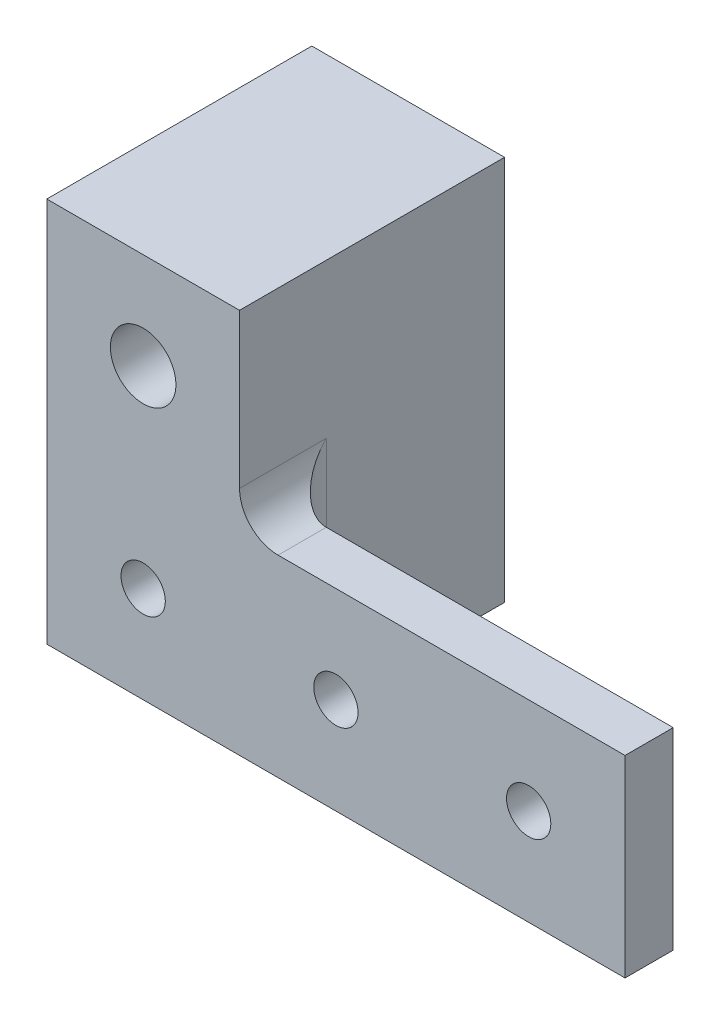
ISO-10303-21;
HEADER;
FILE_DESCRIPTION(('STEP AP214'),'2;1');
FILE_NAME('part.step','',(''),(''),'','','');
FILE_SCHEMA(('AUTOMOTIVE_DESIGN { 1 0 10303 214 1 1 1 1 }'));
ENDSEC;
DATA;
#1=APPLICATION_CONTEXT('core data for automotive mechanical design processes');
#2=APPLICATION_PROTOCOL_DEFINITION('international standard','automotive_design',2000,#1);
#3=PRODUCT_CONTEXT('',#1,'mechanical');
#4=PRODUCT('Part','Part','',(#3));
#5=PRODUCT_RELATED_PRODUCT_CATEGORY('part','',(#4));
#6=PRODUCT_DEFINITION_FORMATION('','',#4);
#7=PRODUCT_DEFINITION_CONTEXT('part definition',#1,'design');
#8=PRODUCT_DEFINITION('design','',#6,#7);
#9=PRODUCT_DEFINITION_SHAPE('','',#8);
#10=(LENGTH_UNIT() NAMED_UNIT(*) SI_UNIT(.MILLI.,.METRE.));
#11=(NAMED_UNIT(*) PLANE_ANGLE_UNIT() SI_UNIT($,.RADIAN.));
#12=(NAMED_UNIT(*) SI_UNIT($,.STERADIAN.) SOLID_ANGLE_UNIT());
#13=UNCERTAINTY_MEASURE_WITH_UNIT(LENGTH_MEASURE(1.E-05),#10,'distance_accuracy_value','');
#14=(GEOMETRIC_REPRESENTATION_CONTEXT(3) GLOBAL_UNCERTAINTY_ASSIGNED_CONTEXT((#13)) GLOBAL_UNIT_ASSIGNED_CONTEXT((#10,
#11,#12)) REPRESENTATION_CONTEXT('',''));
#15=CARTESIAN_POINT('',(0.,0.,0.));
#16=DIRECTION('',(0.,0.,1.));
#17=DIRECTION('',(1.,0.,0.));
#18=AXIS2_PLACEMENT_3D('',#15,#16,#17);
#19=CARTESIAN_POINT('',(12.7,38.1,0.));
#20=DIRECTION('',(0.,0.,1.));
#21=DIRECTION('',(1.,0.,0.));
#22=AXIS2_PLACEMENT_3D('',#19,#20,#21);
#23=CYLINDRICAL_SURFACE('',#22,2.921);
#24=CARTESIAN_POINT('',(12.7,38.1,0.));
#25=DIRECTION('',(0.,0.,1.));
#26=DIRECTION('',(1.,0.,0.));
#27=AXIS2_PLACEMENT_3D('',#24,#25,#26);
#28=CIRCLE('',#27,2.921);
#29=CARTESIAN_POINT('',(15.621,38.1,0.));
#30=VERTEX_POINT('',#29);
#31=EDGE_CURVE('E168',#30,#30,#28,.T.);
#32=ORIENTED_EDGE('',*,*,#31,.F.);
#33=EDGE_LOOP('',(#32));
#34=FACE_BOUND('',#33,.T.);
#35=CARTESIAN_POINT('',(12.7,38.1,22.225));
#36=DIRECTION('',(0.,0.,1.));
#37=DIRECTION('',(1.,0.,0.));
#38=AXIS2_PLACEMENT_3D('',#35,#36,#37);
#39=CIRCLE('',#38,2.921);
#40=CARTESIAN_POINT('',(15.621,38.1,22.225));
#41=VERTEX_POINT('',#40);
#42=EDGE_CURVE('E41',#41,#41,#39,.F.);
#43=ORIENTED_EDGE('',*,*,#42,.F.);
#44=EDGE_LOOP('',(#43));
#45=FACE_BOUND('',#44,.T.);
#46=ADVANCED_FACE('F37',(#34,#45),#23,.F.);
#47=CARTESIAN_POINT('',(76.2,0.,34.925));
#48=DIRECTION('',(0.,1.,0.));
#49=DIRECTION('',(-1.,0.,0.));
#50=AXIS2_PLACEMENT_3D('',#47,#48,#49);
#51=PLANE('',#50);
#52=DIRECTION('',(1.,0.,0.));
#53=VECTOR('',#52,1.);
#54=CARTESIAN_POINT('',(76.2,0.,0.));
#55=LINE('',#54,#53);
#56=CARTESIAN_POINT('',(0.,0.,0.));
#57=VERTEX_POINT('',#56);
#58=CARTESIAN_POINT('',(25.4,0.,0.));
#59=VERTEX_POINT('',#58);
#60=EDGE_CURVE('E171',#57,#59,#55,.T.);
#61=ORIENTED_EDGE('',*,*,#60,.T.);
#62=DIRECTION('',(0.,0.,-1.));
#63=VECTOR('',#62,1.);
#64=CARTESIAN_POINT('',(25.4,0.,0.));
#65=LINE('',#64,#63);
#66=CARTESIAN_POINT('',(25.4,0.,23.495));
#67=VERTEX_POINT('',#66);
#68=EDGE_CURVE('E118',#67,#59,#65,.T.);
#69=ORIENTED_EDGE('',*,*,#68,.F.);
#70=CARTESIAN_POINT('',(30.48,0.,23.495));
#71=DIRECTION('',(0.,1.,0.));
#72=DIRECTION('',(-1.,0.,0.));
#73=AXIS2_PLACEMENT_3D('',#70,#71,#72);
#74=CIRCLE('',#73,5.08);
#75=CARTESIAN_POINT('',(30.48,0.,28.575));
#76=VERTEX_POINT('',#75);
#77=EDGE_CURVE('E11',#67,#76,#74,.T.);
#78=ORIENTED_EDGE('',*,*,#77,.T.);
#79=DIRECTION('',(-1.,0.,0.));
#80=VECTOR('',#79,1.);
#81=CARTESIAN_POINT('',(76.2,0.,28.575));
#82=LINE('',#81,#80);
#83=CARTESIAN_POINT('',(76.2,0.,28.575));
#84=VERTEX_POINT('',#83);
#85=EDGE_CURVE('E110',#84,#76,#82,.T.);
#86=ORIENTED_EDGE('',*,*,#85,.F.);
#87=DIRECTION('',(0.,0.,-1.));
#88=VECTOR('',#87,1.);
#89=CARTESIAN_POINT('',(76.2,0.,34.925));
#90=LINE('',#89,#88);
#91=CARTESIAN_POINT('',(76.2,0.,34.925));
#92=VERTEX_POINT('',#91);
#93=EDGE_CURVE('E124',#92,#84,#90,.T.);
#94=ORIENTED_EDGE('',*,*,#93,.F.);
#95=DIRECTION('',(1.,0.,0.));
#96=VECTOR('',#95,1.);
#97=CARTESIAN_POINT('',(76.2,0.,34.925));
#98=LINE('',#97,#96);
#99=CARTESIAN_POINT('',(0.,0.,34.925));
#100=VERTEX_POINT('',#99);
#101=EDGE_CURVE('E183',#100,#92,#98,.T.);
#102=ORIENTED_EDGE('',*,*,#101,.F.);
#103=DIRECTION('',(0.,0.,-1.));
#104=VECTOR('',#103,1.);
#105=CARTESIAN_POINT('',(0.,0.,34.925));
#106=LINE('',#105,#104);
#107=EDGE_CURVE('E195',#100,#57,#106,.T.);
#108=ORIENTED_EDGE('',*,*,#107,.T.);
#109=EDGE_LOOP('',(#61,#69,#78,#86,#94,#102,#108));
#110=FACE_BOUND('',#109,.T.);
#111=ADVANCED_FACE('F122',(#110),#51,.F.);
#112=CARTESIAN_POINT('',(76.2,25.4,34.925));
#113=DIRECTION('',(-1.,0.,0.));
#114=DIRECTION('',(0.,0.,1.));
#115=AXIS2_PLACEMENT_3D('',#112,#113,#114);
#116=PLANE('',#115);
#117=ORIENTED_EDGE('',*,*,#93,.T.);
#118=DIRECTION('',(0.,-1.,0.));
#119=VECTOR('',#118,1.);
#120=CARTESIAN_POINT('',(76.2,50.8,28.575));
#121=LINE('',#120,#119);
#122=CARTESIAN_POINT('',(76.2,25.4,28.575));
#123=VERTEX_POINT('',#122);
#124=EDGE_CURVE('E108',#123,#84,#121,.T.);
#125=ORIENTED_EDGE('',*,*,#124,.F.);
#126=DIRECTION('',(0.,0.,-1.));
#127=VECTOR('',#126,1.);
#128=CARTESIAN_POINT('',(76.2,25.4,34.925));
#129=LINE('',#128,#127);
#130=CARTESIAN_POINT('',(76.2,25.4,34.925));
#131=VERTEX_POINT('',#130);
#132=EDGE_CURVE('E131',#131,#123,#129,.T.);
#133=ORIENTED_EDGE('',*,*,#132,.F.);
#134=DIRECTION('',(0.,1.,0.));
#135=VECTOR('',#134,1.);
#136=CARTESIAN_POINT('',(76.2,25.4,34.925));
#137=LINE('',#136,#135);
#138=EDGE_CURVE('E128',#92,#131,#137,.T.);
#139=ORIENTED_EDGE('',*,*,#138,.F.);
#140=EDGE_LOOP('',(#117,#125,#133,#139));
#141=FACE_BOUND('',#140,.T.);
#142=ADVANCED_FACE('F127',(#141),#116,.F.);
#143=CARTESIAN_POINT('',(25.4,25.4,34.925));
#144=DIRECTION('',(0.,-1.,0.));
#145=DIRECTION('',(1.,0.,0.));
#146=AXIS2_PLACEMENT_3D('',#143,#144,#145);
#147=PLANE('',#146);
#148=DIRECTION('',(-1.,0.,0.));
#149=VECTOR('',#148,1.);
#150=CARTESIAN_POINT('',(25.4,25.4,28.575));
#151=LINE('',#150,#149);
#152=CARTESIAN_POINT('',(30.48,25.4,28.575));
#153=VERTEX_POINT('',#152);
#154=EDGE_CURVE('E112',#123,#153,#151,.T.);
#155=ORIENTED_EDGE('',*,*,#154,.T.);
#156=DIRECTION('',(0.,0.,-1.));
#157=VECTOR('',#156,1.);
#158=CARTESIAN_POINT('',(30.48,25.4,34.925));
#159=LINE('',#158,#157);
#160=CARTESIAN_POINT('',(30.48,25.4,34.925));
#161=VERTEX_POINT('',#160);
#162=EDGE_CURVE('E60',#153,#161,#159,.F.);
#163=ORIENTED_EDGE('',*,*,#162,.T.);
#164=DIRECTION('',(-1.,0.,0.));
#165=VECTOR('',#164,1.);
#166=CARTESIAN_POINT('',(25.4,25.4,34.925));
#167=LINE('',#166,#165);
#168=EDGE_CURVE('E187',#131,#161,#167,.T.);
#169=ORIENTED_EDGE('',*,*,#168,.F.);
#170=ORIENTED_EDGE('',*,*,#132,.T.);
#171=EDGE_LOOP('',(#155,#163,#169,#170));
#172=FACE_BOUND('',#171,.T.);
#173=ADVANCED_FACE('F231',(#172),#147,.F.);
#174=CARTESIAN_POINT('',(25.4,50.8,34.925));
#175=DIRECTION('',(-1.,0.,0.));
#176=DIRECTION('',(0.,-1.,0.));
#177=AXIS2_PLACEMENT_3D('',#174,#175,#176);
#178=PLANE('',#177);
#179=DIRECTION('',(0.,1.,0.));
#180=VECTOR('',#179,1.);
#181=CARTESIAN_POINT('',(25.4,50.8,34.925));
#182=LINE('',#181,#180);
#183=CARTESIAN_POINT('',(25.4,30.48,34.925));
#184=VERTEX_POINT('',#183);
#185=CARTESIAN_POINT('',(25.4,50.8,34.925));
#186=VERTEX_POINT('',#185);
#187=EDGE_CURVE('E189',#184,#186,#182,.T.);
#188=ORIENTED_EDGE('',*,*,#187,.F.);
#189=DIRECTION('',(0.,0.,-1.));
#190=VECTOR('',#189,1.);
#191=CARTESIAN_POINT('',(25.4,30.48,28.575));
#192=LINE('',#191,#190);
#193=CARTESIAN_POINT('',(25.4,30.48,23.495));
#194=VERTEX_POINT('',#193);
#195=EDGE_CURVE('E133',#184,#194,#192,.T.);
#196=ORIENTED_EDGE('',*,*,#195,.T.);
#197=DIRECTION('',(0.,-1.,0.));
#198=VECTOR('',#197,1.);
#199=CARTESIAN_POINT('',(25.4,0.,23.495));
#200=LINE('',#199,#198);
#201=EDGE_CURVE('E130',#194,#67,#200,.T.);
#202=ORIENTED_EDGE('',*,*,#201,.T.);
#203=ORIENTED_EDGE('',*,*,#68,.T.);
#204=DIRECTION('',(0.,1.,0.));
#205=VECTOR('',#204,1.);
#206=CARTESIAN_POINT('',(25.4,50.8,0.));
#207=LINE('',#206,#205);
#208=CARTESIAN_POINT('',(25.4,50.8,0.));
#209=VERTEX_POINT('',#208);
#210=EDGE_CURVE('E197',#59,#209,#207,.T.);
#211=ORIENTED_EDGE('',*,*,#210,.T.);
#212=DIRECTION('',(0.,0.,-1.));
#213=VECTOR('',#212,1.);
#214=CARTESIAN_POINT('',(25.4,50.8,34.925));
#215=LINE('',#214,#213);
#216=EDGE_CURVE('E135',#186,#209,#215,.T.);
#217=ORIENTED_EDGE('',*,*,#216,.F.);
#218=EDGE_LOOP('',(#188,#196,#202,#203,#211,#217));
#219=FACE_BOUND('',#218,.T.);
#220=ADVANCED_FACE('F216',(#219),#178,.F.);
#221=CARTESIAN_POINT('',(0.,50.8,34.925));
#222=DIRECTION('',(0.,-1.,0.));
#223=DIRECTION('',(0.,0.,-1.));
#224=AXIS2_PLACEMENT_3D('',#221,#222,#223);
#225=PLANE('',#224);
#226=DIRECTION('',(-1.,0.,0.));
#227=VECTOR('',#226,1.);
#228=CARTESIAN_POINT('',(0.,50.8,0.));
#229=LINE('',#228,#227);
#230=CARTESIAN_POINT('',(0.,50.8,0.));
#231=VERTEX_POINT('',#230);
#232=EDGE_CURVE('E200',#209,#231,#229,.T.);
#233=ORIENTED_EDGE('',*,*,#232,.T.);
#234=DIRECTION('',(0.,0.,-1.));
#235=VECTOR('',#234,1.);
#236=CARTESIAN_POINT('',(0.,50.8,34.925));
#237=LINE('',#236,#235);
#238=CARTESIAN_POINT('',(0.,50.8,34.925));
#239=VERTEX_POINT('',#238);
#240=EDGE_CURVE('E205',#239,#231,#237,.T.);
#241=ORIENTED_EDGE('',*,*,#240,.F.);
#242=DIRECTION('',(-1.,0.,0.));
#243=VECTOR('',#242,1.);
#244=CARTESIAN_POINT('',(0.,50.8,34.925));
#245=LINE('',#244,#243);
#246=EDGE_CURVE('E191',#186,#239,#245,.T.);
#247=ORIENTED_EDGE('',*,*,#246,.F.);
#248=ORIENTED_EDGE('',*,*,#216,.T.);
#249=EDGE_LOOP('',(#233,#241,#247,#248));
#250=FACE_BOUND('',#249,.T.);
#251=ADVANCED_FACE('F210',(#250),#225,.F.);
#252=CARTESIAN_POINT('',(0.,0.,34.925));
#253=DIRECTION('',(1.,0.,0.));
#254=DIRECTION('',(0.,0.,-1.));
#255=AXIS2_PLACEMENT_3D('',#252,#253,#254);
#256=PLANE('',#255);
#257=DIRECTION('',(0.,-1.,0.));
#258=VECTOR('',#257,1.);
#259=CARTESIAN_POINT('',(0.,0.,0.));
#260=LINE('',#259,#258);
#261=EDGE_CURVE('E185',#231,#57,#260,.T.);
#262=ORIENTED_EDGE('',*,*,#261,.T.);
#263=ORIENTED_EDGE('',*,*,#107,.F.);
#264=DIRECTION('',(0.,-1.,0.));
#265=VECTOR('',#264,1.);
#266=CARTESIAN_POINT('',(0.,0.,34.925));
#267=LINE('',#266,#265);
#268=EDGE_CURVE('E193',#239,#100,#267,.T.);
#269=ORIENTED_EDGE('',*,*,#268,.F.);
#270=ORIENTED_EDGE('',*,*,#240,.T.);
#271=EDGE_LOOP('',(#262,#263,#269,#270));
#272=FACE_BOUND('',#271,.T.);
#273=ADVANCED_FACE('F224',(#272),#256,.F.);
#274=CARTESIAN_POINT('',(0.,0.,34.925));
#275=DIRECTION('',(0.,0.,-1.));
#276=DIRECTION('',(-1.,0.,0.));
#277=AXIS2_PLACEMENT_3D('',#274,#275,#276);
#278=PLANE('',#277);
#279=CARTESIAN_POINT('',(12.7,38.1,34.925));
#280=DIRECTION('',(0.,0.,1.));
#281=DIRECTION('',(1.,0.,0.));
#282=AXIS2_PLACEMENT_3D('',#279,#280,#281);
#283=CIRCLE('',#282,4.318);
#284=CARTESIAN_POINT('',(17.018,38.1,34.925));
#285=VERTEX_POINT('',#284);
#286=EDGE_CURVE('E156',#285,#285,#283,.T.);
#287=ORIENTED_EDGE('',*,*,#286,.F.);
#288=EDGE_LOOP('',(#287));
#289=FACE_BOUND('',#288,.T.);
#290=CARTESIAN_POINT('',(12.7,12.7,34.925));
#291=DIRECTION('',(0.,0.,1.));
#292=DIRECTION('',(1.,0.,0.));
#293=AXIS2_PLACEMENT_3D('',#290,#291,#292);
#294=CIRCLE('',#293,2.921);
#295=CARTESIAN_POINT('',(15.621,12.7,34.925));
#296=VERTEX_POINT('',#295);
#297=EDGE_CURVE('E175',#296,#296,#294,.T.);
#298=ORIENTED_EDGE('',*,*,#297,.F.);
#299=EDGE_LOOP('',(#298));
#300=FACE_BOUND('',#299,.T.);
#301=CARTESIAN_POINT('',(38.1,12.7,34.925));
#302=DIRECTION('',(0.,0.,1.));
#303=DIRECTION('',(1.,0.,0.));
#304=AXIS2_PLACEMENT_3D('',#301,#302,#303);
#305=CIRCLE('',#304,2.921);
#306=CARTESIAN_POINT('',(41.021,12.7,34.925));
#307=VERTEX_POINT('',#306);
#308=EDGE_CURVE('E178',#307,#307,#305,.T.);
#309=ORIENTED_EDGE('',*,*,#308,.F.);
#310=EDGE_LOOP('',(#309));
#311=FACE_BOUND('',#310,.T.);
#312=CARTESIAN_POINT('',(63.5,12.7,34.925));
#313=DIRECTION('',(0.,0.,1.));
#314=DIRECTION('',(1.,0.,0.));
#315=AXIS2_PLACEMENT_3D('',#312,#313,#314);
#316=CIRCLE('',#315,2.92100000000001);
#317=CARTESIAN_POINT('',(66.421,12.7,34.925));
#318=VERTEX_POINT('',#317);
#319=EDGE_CURVE('E167',#318,#318,#316,.T.);
#320=ORIENTED_EDGE('',*,*,#319,.F.);
#321=EDGE_LOOP('',(#320));
#322=FACE_BOUND('',#321,.T.);
#323=ORIENTED_EDGE('',*,*,#101,.T.);
#324=ORIENTED_EDGE('',*,*,#138,.T.);
#325=ORIENTED_EDGE('',*,*,#168,.T.);
#326=CARTESIAN_POINT('',(30.48,30.48,34.925));
#327=DIRECTION('',(0.,0.,-1.));
#328=DIRECTION('',(-1.,0.,0.));
#329=AXIS2_PLACEMENT_3D('',#326,#327,#328);
#330=CIRCLE('',#329,5.08);
#331=EDGE_CURVE('E46',#161,#184,#330,.T.);
#332=ORIENTED_EDGE('',*,*,#331,.T.);
#333=ORIENTED_EDGE('',*,*,#187,.T.);
#334=ORIENTED_EDGE('',*,*,#246,.T.);
#335=ORIENTED_EDGE('',*,*,#268,.T.);
#336=EDGE_LOOP('',(#323,#324,#325,#332,#333,#334,#335));
#337=FACE_BOUND('',#336,.T.);
#338=ADVANCED_FACE('F227',(#289,#300,#311,#322,#337),#278,.F.);
#339=CARTESIAN_POINT('',(0.,0.,0.));
#340=DIRECTION('',(0.,0.,-1.));
#341=DIRECTION('',(-1.,0.,0.));
#342=AXIS2_PLACEMENT_3D('',#339,#340,#341);
#343=PLANE('',#342);
#344=ORIENTED_EDGE('',*,*,#210,.F.);
#345=ORIENTED_EDGE('',*,*,#60,.F.);
#346=ORIENTED_EDGE('',*,*,#261,.F.);
#347=ORIENTED_EDGE('',*,*,#232,.F.);
#348=EDGE_LOOP('',(#344,#345,#346,#347));
#349=FACE_BOUND('',#348,.T.);
#350=ORIENTED_EDGE('',*,*,#31,.T.);
#351=EDGE_LOOP('',(#350));
#352=FACE_BOUND('',#351,.T.);
#353=CARTESIAN_POINT('',(12.7,12.7,0.));
#354=DIRECTION('',(0.,0.,1.));
#355=DIRECTION('',(1.,0.,0.));
#356=AXIS2_PLACEMENT_3D('',#353,#354,#355);
#357=CIRCLE('',#356,2.921);
#358=CARTESIAN_POINT('',(15.621,12.7,0.));
#359=VERTEX_POINT('',#358);
#360=EDGE_CURVE('E172',#359,#359,#357,.T.);
#361=ORIENTED_EDGE('',*,*,#360,.T.);
#362=EDGE_LOOP('',(#361));
#363=FACE_BOUND('',#362,.T.);
#364=ADVANCED_FACE('F220',(#349,#352,#363),#343,.T.);
#365=CARTESIAN_POINT('',(63.5,12.7,0.));
#366=DIRECTION('',(0.,0.,1.));
#367=DIRECTION('',(1.,0.,0.));
#368=AXIS2_PLACEMENT_3D('',#365,#366,#367);
#369=CYLINDRICAL_SURFACE('',#368,2.92100000000001);
#370=CARTESIAN_POINT('',(63.5,12.7,28.575));
#371=DIRECTION('',(0.,0.,1.));
#372=DIRECTION('',(1.,0.,0.));
#373=AXIS2_PLACEMENT_3D('',#370,#371,#372);
#374=CIRCLE('',#373,2.92100000000001);
#375=CARTESIAN_POINT('',(66.421,12.7,28.575));
#376=VERTEX_POINT('',#375);
#377=EDGE_CURVE('E140',#376,#376,#374,.F.);
#378=ORIENTED_EDGE('',*,*,#377,.T.);
#379=EDGE_LOOP('',(#378));
#380=FACE_BOUND('',#379,.T.);
#381=ORIENTED_EDGE('',*,*,#319,.T.);
#382=EDGE_LOOP('',(#381));
#383=FACE_BOUND('',#382,.T.);
#384=ADVANCED_FACE('F259',(#380,#383),#369,.F.);
#385=CARTESIAN_POINT('',(38.1,12.7,0.));
#386=DIRECTION('',(0.,0.,1.));
#387=DIRECTION('',(1.,0.,0.));
#388=AXIS2_PLACEMENT_3D('',#385,#386,#387);
#389=CYLINDRICAL_SURFACE('',#388,2.921);
#390=CARTESIAN_POINT('',(38.1,12.7,28.575));
#391=DIRECTION('',(0.,0.,1.));
#392=DIRECTION('',(1.,0.,0.));
#393=AXIS2_PLACEMENT_3D('',#390,#391,#392);
#394=CIRCLE('',#393,2.921);
#395=CARTESIAN_POINT('',(41.021,12.7,28.575));
#396=VERTEX_POINT('',#395);
#397=EDGE_CURVE('E117',#396,#396,#394,.F.);
#398=ORIENTED_EDGE('',*,*,#397,.T.);
#399=EDGE_LOOP('',(#398));
#400=FACE_BOUND('',#399,.T.);
#401=ORIENTED_EDGE('',*,*,#308,.T.);
#402=EDGE_LOOP('',(#401));
#403=FACE_BOUND('',#402,.T.);
#404=ADVANCED_FACE('F255',(#400,#403),#389,.F.);
#405=CARTESIAN_POINT('',(12.7,12.7,0.));
#406=DIRECTION('',(0.,0.,1.));
#407=DIRECTION('',(1.,0.,0.));
#408=AXIS2_PLACEMENT_3D('',#405,#406,#407);
#409=CYLINDRICAL_SURFACE('',#408,2.921);
#410=ORIENTED_EDGE('',*,*,#360,.F.);
#411=EDGE_LOOP('',(#410));
#412=FACE_BOUND('',#411,.T.);
#413=ORIENTED_EDGE('',*,*,#297,.T.);
#414=EDGE_LOOP('',(#413));
#415=FACE_BOUND('',#414,.T.);
#416=ADVANCED_FACE('F252',(#412,#415),#409,.F.);
#417=CARTESIAN_POINT('',(76.2,50.8,28.575));
#418=DIRECTION('',(0.,0.,1.));
#419=DIRECTION('',(1.,0.,0.));
#420=AXIS2_PLACEMENT_3D('',#417,#418,#419);
#421=PLANE('',#420);
#422=ORIENTED_EDGE('',*,*,#397,.F.);
#423=EDGE_LOOP('',(#422));
#424=FACE_BOUND('',#423,.T.);
#425=ORIENTED_EDGE('',*,*,#377,.F.);
#426=EDGE_LOOP('',(#425));
#427=FACE_BOUND('',#426,.T.);
#428=ORIENTED_EDGE('',*,*,#85,.T.);
#429=DIRECTION('',(0.,-1.,0.));
#430=VECTOR('',#429,1.);
#431=CARTESIAN_POINT('',(30.48,25.4,28.575));
#432=LINE('',#431,#430);
#433=EDGE_CURVE('E145',#76,#153,#432,.F.);
#434=ORIENTED_EDGE('',*,*,#433,.T.);
#435=ORIENTED_EDGE('',*,*,#154,.F.);
#436=ORIENTED_EDGE('',*,*,#124,.T.);
#437=EDGE_LOOP('',(#428,#434,#435,#436));
#438=FACE_BOUND('',#437,.T.);
#439=ADVANCED_FACE('F109',(#424,#427,#438),#421,.F.);
#440=CARTESIAN_POINT('',(30.48,50.8,23.495));
#441=DIRECTION('',(0.,1.,0.));
#442=DIRECTION('',(-1.,0.,0.));
#443=AXIS2_PLACEMENT_3D('',#440,#441,#442);
#444=CYLINDRICAL_SURFACE('',#443,5.08);
#445=ORIENTED_EDGE('',*,*,#77,.F.);
#446=ORIENTED_EDGE('',*,*,#201,.F.);
#447=CARTESIAN_POINT('',(30.48,30.48,23.495));
#448=DIRECTION('',(0.,0.707106781186547,0.707106781186547));
#449=DIRECTION('',(0.,0.707106781186547,-0.707106781186547));
#450=AXIS2_PLACEMENT_3D('',#447,#448,#449);
#451=ELLIPSE('',#450,7.18420489685532,5.08);
#452=EDGE_CURVE('E125',#153,#194,#451,.F.);
#453=ORIENTED_EDGE('',*,*,#452,.F.);
#454=ORIENTED_EDGE('',*,*,#433,.F.);
#455=EDGE_LOOP('',(#445,#446,#453,#454));
#456=FACE_BOUND('',#455,.T.);
#457=ADVANCED_FACE('F39',(#456),#444,.F.);
#458=CARTESIAN_POINT('',(30.48,30.48,34.925));
#459=DIRECTION('',(0.,0.,1.));
#460=DIRECTION('',(1.,0.,0.));
#461=AXIS2_PLACEMENT_3D('',#458,#459,#460);
#462=CYLINDRICAL_SURFACE('',#461,5.08);
#463=ORIENTED_EDGE('',*,*,#331,.F.);
#464=ORIENTED_EDGE('',*,*,#162,.F.);
#465=ORIENTED_EDGE('',*,*,#452,.T.);
#466=ORIENTED_EDGE('',*,*,#195,.F.);
#467=EDGE_LOOP('',(#463,#464,#465,#466));
#468=FACE_BOUND('',#467,.T.);
#469=ADVANCED_FACE('F229',(#468),#462,.F.);
#470=CARTESIAN_POINT('',(12.7,38.1,22.225));
#471=DIRECTION('',(0.,0.,1.));
#472=DIRECTION('',(1.,0.,0.));
#473=AXIS2_PLACEMENT_3D('',#470,#471,#472);
#474=PLANE('',#473);
#475=CARTESIAN_POINT('',(12.7,38.1,22.225));
#476=DIRECTION('',(0.,0.,1.));
#477=DIRECTION('',(1.,0.,0.));
#478=AXIS2_PLACEMENT_3D('',#475,#476,#477);
#479=CIRCLE('',#478,4.318);
#480=CARTESIAN_POINT('',(17.018,38.1,22.225));
#481=VERTEX_POINT('',#480);
#482=EDGE_CURVE('E152',#481,#481,#479,.T.);
#483=ORIENTED_EDGE('',*,*,#482,.T.);
#484=EDGE_LOOP('',(#483));
#485=FACE_BOUND('',#484,.T.);
#486=ORIENTED_EDGE('',*,*,#42,.T.);
#487=EDGE_LOOP('',(#486));
#488=FACE_BOUND('',#487,.T.);
#489=ADVANCED_FACE('F320',(#485,#488),#474,.T.);
#490=CARTESIAN_POINT('',(12.7,38.1,22.225));
#491=DIRECTION('',(0.,0.,1.));
#492=DIRECTION('',(1.,0.,0.));
#493=AXIS2_PLACEMENT_3D('',#490,#491,#492);
#494=CYLINDRICAL_SURFACE('',#493,4.318);
#495=ORIENTED_EDGE('',*,*,#482,.F.);
#496=EDGE_LOOP('',(#495));
#497=FACE_BOUND('',#496,.T.);
#498=ORIENTED_EDGE('',*,*,#286,.T.);
#499=EDGE_LOOP('',(#498));
#500=FACE_BOUND('',#499,.T.);
#501=ADVANCED_FACE('F325',(#497,#500),#494,.F.);
#502=CLOSED_SHELL('',(#46,#111,#142,#173,#220,#251,#273,#338,#364,#384,#404,#416,#439,#457,#469,
#489,#501));
#503=MANIFOLD_SOLID_BREP('B2',#502);
#504=ADVANCED_BREP_SHAPE_REPRESENTATION('',(#18,#503),#14);
#505=SHAPE_DEFINITION_REPRESENTATION(#9,#504);
ENDSEC;
END-ISO-10303-21;
